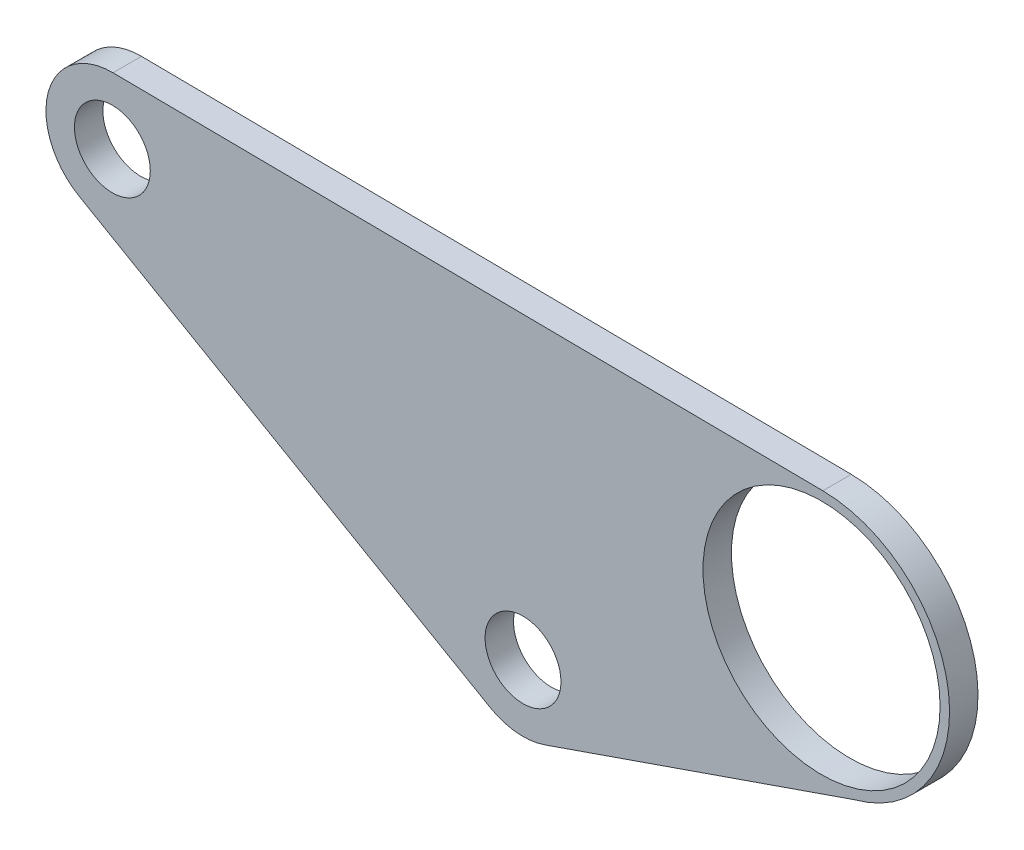
ISO-10303-21;
HEADER;
FILE_DESCRIPTION(('STEP AP214'),'2;1');
FILE_NAME('part.step','',(''),(''),'','','');
FILE_SCHEMA(('AUTOMOTIVE_DESIGN { 1 0 10303 214 1 1 1 1 }'));
ENDSEC;
DATA;
#1=APPLICATION_CONTEXT('core data for automotive mechanical design processes');
#2=APPLICATION_PROTOCOL_DEFINITION('international standard','automotive_design',2000,#1);
#3=PRODUCT_CONTEXT('',#1,'mechanical');
#4=PRODUCT('Part','Part','',(#3));
#5=PRODUCT_RELATED_PRODUCT_CATEGORY('part','',(#4));
#6=PRODUCT_DEFINITION_FORMATION('','',#4);
#7=PRODUCT_DEFINITION_CONTEXT('part definition',#1,'design');
#8=PRODUCT_DEFINITION('design','',#6,#7);
#9=PRODUCT_DEFINITION_SHAPE('','',#8);
#10=(LENGTH_UNIT() NAMED_UNIT(*) SI_UNIT(.MILLI.,.METRE.));
#11=(NAMED_UNIT(*) PLANE_ANGLE_UNIT() SI_UNIT($,.RADIAN.));
#12=(NAMED_UNIT(*) SI_UNIT($,.STERADIAN.) SOLID_ANGLE_UNIT());
#13=UNCERTAINTY_MEASURE_WITH_UNIT(LENGTH_MEASURE(1.E-05),#10,'distance_accuracy_value','');
#14=(GEOMETRIC_REPRESENTATION_CONTEXT(3) GLOBAL_UNCERTAINTY_ASSIGNED_CONTEXT((#13)) GLOBAL_UNIT_ASSIGNED_CONTEXT((#10,
#11,#12)) REPRESENTATION_CONTEXT('',''));
#15=CARTESIAN_POINT('',(0.,0.,0.));
#16=DIRECTION('',(0.,0.,1.));
#17=DIRECTION('',(1.,0.,0.));
#18=AXIS2_PLACEMENT_3D('',#15,#16,#17);
#19=CARTESIAN_POINT('',(81.6431567188326,-202.125033214288,640.));
#20=DIRECTION('',(0.,0.,1.));
#21=DIRECTION('',(1.,0.,0.));
#22=AXIS2_PLACEMENT_3D('',#19,#20,#21);
#23=CYLINDRICAL_SURFACE('',#22,7.00000000000006);
#24=CARTESIAN_POINT('',(81.6431567188326,-202.125033214288,643.));
#25=DIRECTION('',(0.,0.,1.));
#26=DIRECTION('',(1.,0.,0.));
#27=AXIS2_PLACEMENT_3D('',#24,#25,#26);
#28=CIRCLE('',#27,7.00000000000006);
#29=CARTESIAN_POINT('',(81.7131422748294,-195.125383078606,643.));
#30=VERTEX_POINT('',#29);
#31=CARTESIAN_POINT('',(78.1431567188326,-208.18721104078,643.));
#32=VERTEX_POINT('',#31);
#33=EDGE_CURVE('E126',#30,#32,#28,.T.);
#34=ORIENTED_EDGE('',*,*,#33,.F.);
#35=DIRECTION('',(0.,0.,1.));
#36=VECTOR('',#35,1.);
#37=CARTESIAN_POINT('',(81.7131422748294,-195.125383078606,640.));
#38=LINE('',#37,#36);
#39=CARTESIAN_POINT('',(81.7131422748294,-195.125383078606,640.));
#40=VERTEX_POINT('',#39);
#41=EDGE_CURVE('E11',#40,#30,#38,.T.);
#42=ORIENTED_EDGE('',*,*,#41,.F.);
#43=CARTESIAN_POINT('',(81.6431567188326,-202.125033214288,640.));
#44=DIRECTION('',(0.,0.,1.));
#45=DIRECTION('',(1.,0.,0.));
#46=AXIS2_PLACEMENT_3D('',#43,#44,#45);
#47=CIRCLE('',#46,7.00000000000006);
#48=CARTESIAN_POINT('',(78.1431567188326,-208.18721104078,640.));
#49=VERTEX_POINT('',#48);
#50=EDGE_CURVE('E141',#40,#49,#47,.T.);
#51=ORIENTED_EDGE('',*,*,#50,.T.);
#52=DIRECTION('',(0.,0.,1.));
#53=VECTOR('',#52,1.);
#54=CARTESIAN_POINT('',(78.1431567188326,-208.18721104078,640.));
#55=LINE('',#54,#53);
#56=EDGE_CURVE('E44',#49,#32,#55,.T.);
#57=ORIENTED_EDGE('',*,*,#56,.T.);
#58=EDGE_LOOP('',(#34,#42,#51,#57));
#59=FACE_BOUND('',#58,.T.);
#60=ADVANCED_FACE('F41',(#59),#23,.T.);
#61=CARTESIAN_POINT('',(81.7131422748294,-195.125383078606,640.));
#62=DIRECTION('',(0.00999793657096436,0.999950019383131,0.));
#63=DIRECTION('',(-0.999950019383131,0.00999793657096436,0.));
#64=AXIS2_PLACEMENT_3D('',#61,#62,#63);
#65=PLANE('',#64);
#66=DIRECTION('',(-0.99995001938313,0.00999793657096436,0.));
#67=VECTOR('',#66,1.);
#68=CARTESIAN_POINT('',(81.7131422748294,-195.125383078606,643.));
#69=LINE('',#68,#67);
#70=CARTESIAN_POINT('',(156.557431565957,-195.873708937426,643.));
#71=VERTEX_POINT('',#70);
#72=EDGE_CURVE('E139',#71,#30,#69,.T.);
#73=ORIENTED_EDGE('',*,*,#72,.F.);
#74=DIRECTION('',(0.,0.,1.));
#75=VECTOR('',#74,1.);
#76=CARTESIAN_POINT('',(156.557431565957,-195.873708937426,640.));
#77=LINE('',#76,#75);
#78=CARTESIAN_POINT('',(156.557431565957,-195.873708937426,640.));
#79=VERTEX_POINT('',#78);
#80=EDGE_CURVE('E50',#79,#71,#77,.T.);
#81=ORIENTED_EDGE('',*,*,#80,.F.);
#82=DIRECTION('',(-0.99995001938313,0.00999793657096436,0.));
#83=VECTOR('',#82,1.);
#84=CARTESIAN_POINT('',(81.7131422748294,-195.125383078606,640.));
#85=LINE('',#84,#83);
#86=EDGE_CURVE('E116',#79,#40,#85,.T.);
#87=ORIENTED_EDGE('',*,*,#86,.T.);
#88=ORIENTED_EDGE('',*,*,#41,.T.);
#89=EDGE_LOOP('',(#73,#81,#87,#88));
#90=FACE_BOUND('',#89,.T.);
#91=ADVANCED_FACE('F149',(#90),#65,.T.);
#92=CARTESIAN_POINT('',(156.422459422249,-209.373034199098,640.));
#93=DIRECTION('',(0.,0.,1.));
#94=DIRECTION('',(1.,0.,0.));
#95=AXIS2_PLACEMENT_3D('',#92,#93,#94);
#96=CYLINDRICAL_SURFACE('',#95,13.5);
#97=CARTESIAN_POINT('',(156.422459422249,-209.373034199098,643.));
#98=DIRECTION('',(0.,0.,1.));
#99=DIRECTION('',(1.,0.,0.));
#100=AXIS2_PLACEMENT_3D('',#97,#98,#99);
#101=CIRCLE('',#100,13.5);
#102=CARTESIAN_POINT('',(159.916516531133,-222.413032854001,643.));
#103=VERTEX_POINT('',#102);
#104=EDGE_CURVE('E103',#103,#71,#101,.T.);
#105=ORIENTED_EDGE('',*,*,#104,.F.);
#106=DIRECTION('',(0.,0.,1.));
#107=VECTOR('',#106,1.);
#108=CARTESIAN_POINT('',(159.916516531133,-222.413032854001,640.));
#109=LINE('',#108,#107);
#110=CARTESIAN_POINT('',(159.916516531133,-222.413032854001,640.));
#111=VERTEX_POINT('',#110);
#112=EDGE_CURVE('E98',#111,#103,#109,.T.);
#113=ORIENTED_EDGE('',*,*,#112,.F.);
#114=CARTESIAN_POINT('',(156.422459422249,-209.373034199098,640.));
#115=DIRECTION('',(0.,0.,1.));
#116=DIRECTION('',(1.,0.,0.));
#117=AXIS2_PLACEMENT_3D('',#114,#115,#116);
#118=CIRCLE('',#117,13.5);
#119=EDGE_CURVE('E101',#111,#79,#118,.T.);
#120=ORIENTED_EDGE('',*,*,#119,.T.);
#121=ORIENTED_EDGE('',*,*,#80,.T.);
#122=EDGE_LOOP('',(#105,#113,#120,#121));
#123=FACE_BOUND('',#122,.T.);
#124=ADVANCED_FACE('F100',(#123),#96,.T.);
#125=CARTESIAN_POINT('',(127.236693559063,-233.739072343343,640.));
#126=DIRECTION('',(0.327466664429785,-0.944862732722183,0.));
#127=DIRECTION('',(0.944862732722183,0.327466664429785,0.));
#128=AXIS2_PLACEMENT_3D('',#125,#126,#127);
#129=PLANE('',#128);
#130=DIRECTION('',(0.944862732722183,0.327466664429785,0.));
#131=VECTOR('',#130,1.);
#132=CARTESIAN_POINT('',(127.236693559063,-233.739072343343,643.));
#133=LINE('',#132,#131);
#134=CARTESIAN_POINT('',(127.236693559063,-233.739072343343,643.));
#135=VERTEX_POINT('',#134);
#136=EDGE_CURVE('E136',#135,#103,#133,.T.);
#137=ORIENTED_EDGE('',*,*,#136,.F.);
#138=DIRECTION('',(0.,0.,1.));
#139=VECTOR('',#138,1.);
#140=CARTESIAN_POINT('',(127.236693559063,-233.739072343343,640.));
#141=LINE('',#140,#139);
#142=CARTESIAN_POINT('',(127.236693559063,-233.739072343343,640.));
#143=VERTEX_POINT('',#142);
#144=EDGE_CURVE('E108',#143,#135,#141,.T.);
#145=ORIENTED_EDGE('',*,*,#144,.F.);
#146=DIRECTION('',(0.944862732722183,0.327466664429785,0.));
#147=VECTOR('',#146,1.);
#148=CARTESIAN_POINT('',(127.236693559063,-233.739072343343,640.));
#149=LINE('',#148,#147);
#150=EDGE_CURVE('E114',#143,#111,#149,.T.);
#151=ORIENTED_EDGE('',*,*,#150,.T.);
#152=ORIENTED_EDGE('',*,*,#112,.T.);
#153=EDGE_LOOP('',(#137,#145,#151,#152));
#154=FACE_BOUND('',#153,.T.);
#155=ADVANCED_FACE('F118',(#154),#129,.T.);
#156=CARTESIAN_POINT('',(124.944426908055,-227.125033214288,640.));
#157=DIRECTION('',(0.,0.,1.));
#158=DIRECTION('',(1.,0.,0.));
#159=AXIS2_PLACEMENT_3D('',#156,#157,#158);
#160=CYLINDRICAL_SURFACE('',#159,7.00000000000001);
#161=CARTESIAN_POINT('',(124.944426908055,-227.125033214288,643.));
#162=DIRECTION('',(0.,0.,1.));
#163=DIRECTION('',(1.,0.,0.));
#164=AXIS2_PLACEMENT_3D('',#161,#162,#163);
#165=CIRCLE('',#164,7.00000000000001);
#166=CARTESIAN_POINT('',(121.444426908055,-233.187211040779,643.));
#167=VERTEX_POINT('',#166);
#168=EDGE_CURVE('E133',#167,#135,#165,.T.);
#169=ORIENTED_EDGE('',*,*,#168,.F.);
#170=DIRECTION('',(0.,0.,1.));
#171=VECTOR('',#170,1.);
#172=CARTESIAN_POINT('',(121.444426908055,-233.187211040779,640.));
#173=LINE('',#172,#171);
#174=CARTESIAN_POINT('',(121.444426908055,-233.187211040779,640.));
#175=VERTEX_POINT('',#174);
#176=EDGE_CURVE('E144',#175,#167,#173,.T.);
#177=ORIENTED_EDGE('',*,*,#176,.F.);
#178=CARTESIAN_POINT('',(124.944426908055,-227.125033214288,640.));
#179=DIRECTION('',(0.,0.,1.));
#180=DIRECTION('',(1.,0.,0.));
#181=AXIS2_PLACEMENT_3D('',#178,#179,#180);
#182=CIRCLE('',#181,7.00000000000001);
#183=EDGE_CURVE('E119',#175,#143,#182,.T.);
#184=ORIENTED_EDGE('',*,*,#183,.T.);
#185=ORIENTED_EDGE('',*,*,#144,.T.);
#186=EDGE_LOOP('',(#169,#177,#184,#185));
#187=FACE_BOUND('',#186,.T.);
#188=ADVANCED_FACE('F163',(#187),#160,.T.);
#189=CARTESIAN_POINT('',(78.1431567188326,-208.18721104078,640.));
#190=DIRECTION('',(-0.499999999999995,-0.866025403784441,0.));
#191=DIRECTION('',(0.866025403784441,-0.499999999999995,0.));
#192=AXIS2_PLACEMENT_3D('',#189,#190,#191);
#193=PLANE('',#192);
#194=DIRECTION('',(0.866025403784441,-0.499999999999995,0.));
#195=VECTOR('',#194,1.);
#196=CARTESIAN_POINT('',(78.1431567188326,-208.18721104078,643.));
#197=LINE('',#196,#195);
#198=EDGE_CURVE('E129',#32,#167,#197,.T.);
#199=ORIENTED_EDGE('',*,*,#198,.F.);
#200=ORIENTED_EDGE('',*,*,#56,.F.);
#201=DIRECTION('',(0.866025403784441,-0.499999999999995,0.));
#202=VECTOR('',#201,1.);
#203=CARTESIAN_POINT('',(78.1431567188326,-208.18721104078,640.));
#204=LINE('',#203,#202);
#205=EDGE_CURVE('E121',#49,#175,#204,.T.);
#206=ORIENTED_EDGE('',*,*,#205,.T.);
#207=ORIENTED_EDGE('',*,*,#176,.T.);
#208=EDGE_LOOP('',(#199,#200,#206,#207));
#209=FACE_BOUND('',#208,.T.);
#210=ADVANCED_FACE('F146',(#209),#193,.T.);
#211=CARTESIAN_POINT('',(81.6431567188326,-202.125033214288,640.));
#212=DIRECTION('',(0.,0.,1.));
#213=DIRECTION('',(1.,0.,0.));
#214=AXIS2_PLACEMENT_3D('',#211,#212,#213);
#215=PLANE('',#214);
#216=CARTESIAN_POINT('',(156.422459422249,-209.373034199098,640.));
#217=DIRECTION('',(0.,0.,1.));
#218=DIRECTION('',(1.,0.,0.));
#219=AXIS2_PLACEMENT_3D('',#216,#217,#218);
#220=CIRCLE('',#219,12.5);
#221=CARTESIAN_POINT('',(168.922459422249,-209.373034199098,640.));
#222=VERTEX_POINT('',#221);
#223=EDGE_CURVE('E196',#222,#222,#220,.T.);
#224=ORIENTED_EDGE('',*,*,#223,.T.);
#225=EDGE_LOOP('',(#224));
#226=FACE_BOUND('',#225,.T.);
#227=CARTESIAN_POINT('',(124.944426908055,-227.125033214288,640.));
#228=DIRECTION('',(0.,0.,1.));
#229=DIRECTION('',(1.,0.,0.));
#230=AXIS2_PLACEMENT_3D('',#227,#228,#229);
#231=CIRCLE('',#230,3.99999999999997);
#232=CARTESIAN_POINT('',(128.944426908055,-227.125033214288,640.));
#233=VERTEX_POINT('',#232);
#234=EDGE_CURVE('E204',#233,#233,#231,.T.);
#235=ORIENTED_EDGE('',*,*,#234,.T.);
#236=EDGE_LOOP('',(#235));
#237=FACE_BOUND('',#236,.T.);
#238=CARTESIAN_POINT('',(81.6431567188326,-202.125033214288,640.));
#239=DIRECTION('',(0.,0.,1.));
#240=DIRECTION('',(1.,0.,0.));
#241=AXIS2_PLACEMENT_3D('',#238,#239,#240);
#242=CIRCLE('',#241,4.00000000000001);
#243=CARTESIAN_POINT('',(85.6431567188326,-202.125033214288,640.));
#244=VERTEX_POINT('',#243);
#245=EDGE_CURVE('E130',#244,#244,#242,.T.);
#246=ORIENTED_EDGE('',*,*,#245,.T.);
#247=EDGE_LOOP('',(#246));
#248=FACE_BOUND('',#247,.T.);
#249=ORIENTED_EDGE('',*,*,#50,.F.);
#250=ORIENTED_EDGE('',*,*,#86,.F.);
#251=ORIENTED_EDGE('',*,*,#119,.F.);
#252=ORIENTED_EDGE('',*,*,#150,.F.);
#253=ORIENTED_EDGE('',*,*,#183,.F.);
#254=ORIENTED_EDGE('',*,*,#205,.F.);
#255=EDGE_LOOP('',(#249,#250,#251,#252,#253,#254));
#256=FACE_BOUND('',#255,.T.);
#257=ADVANCED_FACE('F112',(#226,#237,#248,#256),#215,.F.);
#258=CARTESIAN_POINT('',(81.6431567188326,-202.125033214288,643.));
#259=DIRECTION('',(0.,0.,1.));
#260=DIRECTION('',(1.,0.,0.));
#261=AXIS2_PLACEMENT_3D('',#258,#259,#260);
#262=PLANE('',#261);
#263=CARTESIAN_POINT('',(156.422459422249,-209.373034199098,643.));
#264=DIRECTION('',(0.,0.,1.));
#265=DIRECTION('',(1.,0.,0.));
#266=AXIS2_PLACEMENT_3D('',#263,#264,#265);
#267=CIRCLE('',#266,12.5);
#268=CARTESIAN_POINT('',(168.922459422249,-209.373034199098,643.));
#269=VERTEX_POINT('',#268);
#270=EDGE_CURVE('E199',#269,#269,#267,.T.);
#271=ORIENTED_EDGE('',*,*,#270,.F.);
#272=EDGE_LOOP('',(#271));
#273=FACE_BOUND('',#272,.T.);
#274=CARTESIAN_POINT('',(124.944426908055,-227.125033214288,643.));
#275=DIRECTION('',(0.,0.,1.));
#276=DIRECTION('',(1.,0.,0.));
#277=AXIS2_PLACEMENT_3D('',#274,#275,#276);
#278=CIRCLE('',#277,3.99999999999997);
#279=CARTESIAN_POINT('',(128.944426908055,-227.125033214288,643.));
#280=VERTEX_POINT('',#279);
#281=EDGE_CURVE('E201',#280,#280,#278,.T.);
#282=ORIENTED_EDGE('',*,*,#281,.F.);
#283=EDGE_LOOP('',(#282));
#284=FACE_BOUND('',#283,.T.);
#285=CARTESIAN_POINT('',(81.6431567188326,-202.125033214288,643.));
#286=DIRECTION('',(0.,0.,1.));
#287=DIRECTION('',(1.,0.,0.));
#288=AXIS2_PLACEMENT_3D('',#285,#286,#287);
#289=CIRCLE('',#288,4.00000000000001);
#290=CARTESIAN_POINT('',(85.6431567188326,-202.125033214288,643.));
#291=VERTEX_POINT('',#290);
#292=EDGE_CURVE('E207',#291,#291,#289,.T.);
#293=ORIENTED_EDGE('',*,*,#292,.F.);
#294=EDGE_LOOP('',(#293));
#295=FACE_BOUND('',#294,.T.);
#296=ORIENTED_EDGE('',*,*,#33,.T.);
#297=ORIENTED_EDGE('',*,*,#198,.T.);
#298=ORIENTED_EDGE('',*,*,#168,.T.);
#299=ORIENTED_EDGE('',*,*,#136,.T.);
#300=ORIENTED_EDGE('',*,*,#104,.T.);
#301=ORIENTED_EDGE('',*,*,#72,.T.);
#302=EDGE_LOOP('',(#296,#297,#298,#299,#300,#301));
#303=FACE_BOUND('',#302,.T.);
#304=ADVANCED_FACE('F148',(#273,#284,#295,#303),#262,.T.);
#305=CARTESIAN_POINT('',(81.6431567188326,-202.125033214288,640.));
#306=DIRECTION('',(0.,0.,1.));
#307=DIRECTION('',(1.,0.,0.));
#308=AXIS2_PLACEMENT_3D('',#305,#306,#307);
#309=CYLINDRICAL_SURFACE('',#308,4.00000000000001);
#310=ORIENTED_EDGE('',*,*,#245,.F.);
#311=EDGE_LOOP('',(#310));
#312=FACE_BOUND('',#311,.T.);
#313=ORIENTED_EDGE('',*,*,#292,.T.);
#314=EDGE_LOOP('',(#313));
#315=FACE_BOUND('',#314,.T.);
#316=ADVANCED_FACE('F176',(#312,#315),#309,.F.);
#317=CARTESIAN_POINT('',(124.944426908055,-227.125033214288,640.));
#318=DIRECTION('',(0.,0.,1.));
#319=DIRECTION('',(1.,0.,0.));
#320=AXIS2_PLACEMENT_3D('',#317,#318,#319);
#321=CYLINDRICAL_SURFACE('',#320,3.99999999999997);
#322=ORIENTED_EDGE('',*,*,#234,.F.);
#323=EDGE_LOOP('',(#322));
#324=FACE_BOUND('',#323,.T.);
#325=ORIENTED_EDGE('',*,*,#281,.T.);
#326=EDGE_LOOP('',(#325));
#327=FACE_BOUND('',#326,.T.);
#328=ADVANCED_FACE('F183',(#324,#327),#321,.F.);
#329=CARTESIAN_POINT('',(156.422459422249,-209.373034199098,640.));
#330=DIRECTION('',(0.,0.,1.));
#331=DIRECTION('',(1.,0.,0.));
#332=AXIS2_PLACEMENT_3D('',#329,#330,#331);
#333=CYLINDRICAL_SURFACE('',#332,12.5);
#334=ORIENTED_EDGE('',*,*,#223,.F.);
#335=EDGE_LOOP('',(#334));
#336=FACE_BOUND('',#335,.T.);
#337=ORIENTED_EDGE('',*,*,#270,.T.);
#338=EDGE_LOOP('',(#337));
#339=FACE_BOUND('',#338,.T.);
#340=ADVANCED_FACE('F187',(#336,#339),#333,.F.);
#341=CLOSED_SHELL('',(#60,#91,#124,#155,#188,#210,#257,#304,#316,#328,#340));
#342=MANIFOLD_SOLID_BREP('B2',#341);
#343=ADVANCED_BREP_SHAPE_REPRESENTATION('',(#18,#342),#14);
#344=SHAPE_DEFINITION_REPRESENTATION(#9,#343);
ENDSEC;
END-ISO-10303-21;
